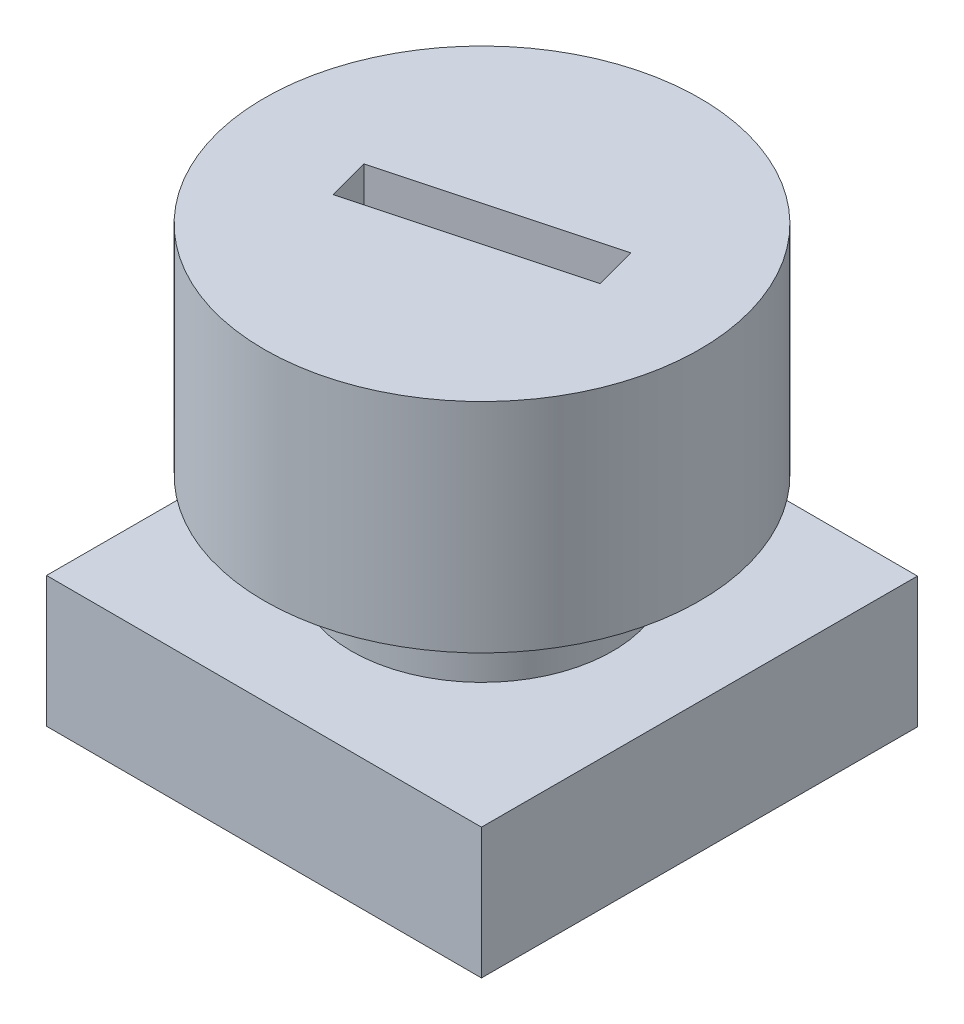
ISO-10303-21;
HEADER;
FILE_DESCRIPTION(('STEP AP214'),'2;1');
FILE_NAME('part.step','',(''),(''),'','','');
FILE_SCHEMA(('AUTOMOTIVE_DESIGN { 1 0 10303 214 1 1 1 1 }'));
ENDSEC;
DATA;
#1=APPLICATION_CONTEXT('core data for automotive mechanical design processes');
#2=APPLICATION_PROTOCOL_DEFINITION('international standard','automotive_design',2000,#1);
#3=PRODUCT_CONTEXT('',#1,'mechanical');
#4=PRODUCT('Part','Part','',(#3));
#5=PRODUCT_RELATED_PRODUCT_CATEGORY('part','',(#4));
#6=PRODUCT_DEFINITION_FORMATION('','',#4);
#7=PRODUCT_DEFINITION_CONTEXT('part definition',#1,'design');
#8=PRODUCT_DEFINITION('design','',#6,#7);
#9=PRODUCT_DEFINITION_SHAPE('','',#8);
#10=(LENGTH_UNIT() NAMED_UNIT(*) SI_UNIT(.MILLI.,.METRE.));
#11=(NAMED_UNIT(*) PLANE_ANGLE_UNIT() SI_UNIT($,.RADIAN.));
#12=(NAMED_UNIT(*) SI_UNIT($,.STERADIAN.) SOLID_ANGLE_UNIT());
#13=UNCERTAINTY_MEASURE_WITH_UNIT(LENGTH_MEASURE(1.E-05),#10,'distance_accuracy_value','');
#14=(GEOMETRIC_REPRESENTATION_CONTEXT(3) GLOBAL_UNCERTAINTY_ASSIGNED_CONTEXT((#13)) GLOBAL_UNIT_ASSIGNED_CONTEXT((#10,
#11,#12)) REPRESENTATION_CONTEXT('',''));
#15=CARTESIAN_POINT('',(0.,0.,0.));
#16=DIRECTION('',(0.,0.,1.));
#17=DIRECTION('',(1.,0.,0.));
#18=AXIS2_PLACEMENT_3D('',#15,#16,#17);
#19=CARTESIAN_POINT('',(0.,5.,0.));
#20=DIRECTION('',(0.,-1.,0.));
#21=DIRECTION('',(0.,0.,-1.));
#22=AXIS2_PLACEMENT_3D('',#19,#20,#21);
#23=CYLINDRICAL_SURFACE('',#22,5.);
#24=CARTESIAN_POINT('',(0.,5.,0.));
#25=DIRECTION('',(0.,1.,0.));
#26=DIRECTION('',(0.,0.,1.));
#27=AXIS2_PLACEMENT_3D('',#24,#25,#26);
#28=CIRCLE('',#27,5.);
#29=CARTESIAN_POINT('',(0.,5.,5.));
#30=VERTEX_POINT('',#29);
#31=EDGE_CURVE('E46',#30,#30,#28,.T.);
#32=ORIENTED_EDGE('',*,*,#31,.F.);
#33=EDGE_LOOP('',(#32));
#34=FACE_BOUND('',#33,.T.);
#35=CARTESIAN_POINT('',(0.,0.,0.));
#36=DIRECTION('',(0.,1.,0.));
#37=DIRECTION('',(0.,0.,1.));
#38=AXIS2_PLACEMENT_3D('',#35,#36,#37);
#39=CIRCLE('',#38,5.);
#40=CARTESIAN_POINT('',(0.,0.,5.));
#41=VERTEX_POINT('',#40);
#42=EDGE_CURVE('E183',#41,#41,#39,.T.);
#43=ORIENTED_EDGE('',*,*,#42,.T.);
#44=EDGE_LOOP('',(#43));
#45=FACE_BOUND('',#44,.T.);
#46=ADVANCED_FACE('F39',(#34,#45),#23,.T.);
#47=CARTESIAN_POINT('',(0.,5.,0.));
#48=DIRECTION('',(0.,1.,0.));
#49=DIRECTION('',(0.,0.,1.));
#50=AXIS2_PLACEMENT_3D('',#47,#48,#49);
#51=PLANE('',#50);
#52=DIRECTION('',(-0.258819045102243,0.,-0.965925826289143));
#53=VECTOR('',#52,1.);
#54=CARTESIAN_POINT('',(2.5442240882737,5.,-0.164084699611723));
#55=LINE('',#54,#53);
#56=CARTESIAN_POINT('',(2.5442240882737,5.,-0.164084699611723));
#57=VERTEX_POINT('',#56);
#58=CARTESIAN_POINT('',(2.28540504317146,5.,-1.13001052590085));
#59=VERTEX_POINT('',#58);
#60=EDGE_CURVE('E53',#57,#59,#55,.T.);
#61=ORIENTED_EDGE('',*,*,#60,.F.);
#62=DIRECTION('',(0.965925826289069,0.,-0.25881904510252));
#63=VECTOR('',#62,1.);
#64=CARTESIAN_POINT('',(-2.28540504317146,5.,1.13001052590083));
#65=LINE('',#64,#63);
#66=CARTESIAN_POINT('',(-2.28540504317146,5.,1.13001052590083));
#67=VERTEX_POINT('',#66);
#68=EDGE_CURVE('E133',#67,#57,#65,.T.);
#69=ORIENTED_EDGE('',*,*,#68,.F.);
#70=DIRECTION('',(0.258819045102424,0.,0.965925826289094));
#71=VECTOR('',#70,1.);
#72=CARTESIAN_POINT('',(-2.28540504317146,5.,1.13001052590083));
#73=LINE('',#72,#71);
#74=CARTESIAN_POINT('',(-2.54422408827389,5.,0.164084699611735));
#75=VERTEX_POINT('',#74);
#76=EDGE_CURVE('E136',#75,#67,#73,.T.);
#77=ORIENTED_EDGE('',*,*,#76,.F.);
#78=DIRECTION('',(-0.965925826289069,0.,0.258819045102518));
#79=VECTOR('',#78,1.);
#80=CARTESIAN_POINT('',(-2.54422408827389,5.,0.164084699611735));
#81=LINE('',#80,#79);
#82=EDGE_CURVE('E142',#59,#75,#81,.T.);
#83=ORIENTED_EDGE('',*,*,#82,.F.);
#84=EDGE_LOOP('',(#61,#69,#77,#83));
#85=FACE_BOUND('',#84,.T.);
#86=ORIENTED_EDGE('',*,*,#31,.T.);
#87=EDGE_LOOP('',(#86));
#88=FACE_BOUND('',#87,.T.);
#89=ADVANCED_FACE('F192',(#85,#88),#51,.T.);
#90=CARTESIAN_POINT('',(0.,0.,0.));
#91=DIRECTION('',(0.,1.,0.));
#92=DIRECTION('',(0.,0.,1.));
#93=AXIS2_PLACEMENT_3D('',#90,#91,#92);
#94=PLANE('',#93);
#95=CARTESIAN_POINT('',(0.,0.,0.));
#96=DIRECTION('',(0.,1.,0.));
#97=DIRECTION('',(0.,0.,1.));
#98=AXIS2_PLACEMENT_3D('',#95,#96,#97);
#99=CIRCLE('',#98,3.);
#100=CARTESIAN_POINT('',(0.,0.,3.));
#101=VERTEX_POINT('',#100);
#102=EDGE_CURVE('E11',#101,#101,#99,.F.);
#103=ORIENTED_EDGE('',*,*,#102,.F.);
#104=EDGE_LOOP('',(#103));
#105=FACE_BOUND('',#104,.T.);
#106=ORIENTED_EDGE('',*,*,#42,.F.);
#107=EDGE_LOOP('',(#106));
#108=FACE_BOUND('',#107,.T.);
#109=ADVANCED_FACE('F189',(#105,#108),#94,.F.);
#110=CARTESIAN_POINT('',(0.,-2.,0.));
#111=DIRECTION('',(0.,1.,0.));
#112=DIRECTION('',(0.,0.,1.));
#113=AXIS2_PLACEMENT_3D('',#110,#111,#112);
#114=CYLINDRICAL_SURFACE('',#113,3.);
#115=CARTESIAN_POINT('',(0.,-2.,0.));
#116=DIRECTION('',(0.,-1.,0.));
#117=DIRECTION('',(0.,0.,-1.));
#118=AXIS2_PLACEMENT_3D('',#115,#116,#117);
#119=CIRCLE('',#118,3.);
#120=CARTESIAN_POINT('',(0.,-2.,-3.));
#121=VERTEX_POINT('',#120);
#122=EDGE_CURVE('E180',#121,#121,#119,.T.);
#123=ORIENTED_EDGE('',*,*,#122,.F.);
#124=EDGE_LOOP('',(#123));
#125=FACE_BOUND('',#124,.T.);
#126=ORIENTED_EDGE('',*,*,#102,.T.);
#127=EDGE_LOOP('',(#126));
#128=FACE_BOUND('',#127,.T.);
#129=ADVANCED_FACE('F191',(#125,#128),#114,.T.);
#130=CARTESIAN_POINT('',(5.00630118971393,-5.,-4.9936908592612));
#131=DIRECTION('',(-0.999999204897513,0.,-0.00126103304527317));
#132=DIRECTION('',(-0.00126103304527317,0.,0.999999204897513));
#133=AXIS2_PLACEMENT_3D('',#130,#131,#132);
#134=PLANE('',#133);
#135=DIRECTION('',(-0.00126103304527317,0.,0.999999204897513));
#136=VECTOR('',#135,1.);
#137=CARTESIAN_POINT('',(5.00630118971393,-2.,-4.9936908592612));
#138=LINE('',#137,#136);
#139=CARTESIAN_POINT('',(5.00630118971393,-2.,-4.9936908592612));
#140=VERTEX_POINT('',#139);
#141=CARTESIAN_POINT('',(4.9936908592612,-2.,5.00630118971393));
#142=VERTEX_POINT('',#141);
#143=EDGE_CURVE('E155',#140,#142,#138,.T.);
#144=ORIENTED_EDGE('',*,*,#143,.T.);
#145=DIRECTION('',(0.,1.,0.));
#146=VECTOR('',#145,1.);
#147=CARTESIAN_POINT('',(4.9936908592612,-5.,5.00630118971393));
#148=LINE('',#147,#146);
#149=CARTESIAN_POINT('',(4.9936908592612,-5.,5.00630118971393));
#150=VERTEX_POINT('',#149);
#151=EDGE_CURVE('E178',#150,#142,#148,.T.);
#152=ORIENTED_EDGE('',*,*,#151,.F.);
#153=DIRECTION('',(-0.00126103304527317,0.,0.999999204897513));
#154=VECTOR('',#153,1.);
#155=CARTESIAN_POINT('',(5.00630118971393,-5.,-4.9936908592612));
#156=LINE('',#155,#154);
#157=CARTESIAN_POINT('',(5.00630118971393,-5.,-4.9936908592612));
#158=VERTEX_POINT('',#157);
#159=EDGE_CURVE('E158',#158,#150,#156,.T.);
#160=ORIENTED_EDGE('',*,*,#159,.F.);
#161=DIRECTION('',(0.,1.,0.));
#162=VECTOR('',#161,1.);
#163=CARTESIAN_POINT('',(5.00630118971393,-5.,-4.9936908592612));
#164=LINE('',#163,#162);
#165=EDGE_CURVE('E164',#158,#140,#164,.T.);
#166=ORIENTED_EDGE('',*,*,#165,.T.);
#167=EDGE_LOOP('',(#144,#152,#160,#166));
#168=FACE_BOUND('',#167,.T.);
#169=ADVANCED_FACE('F198',(#168),#134,.F.);
#170=CARTESIAN_POINT('',(4.9936908592612,-5.,5.00630118971393));
#171=DIRECTION('',(0.00126103304527326,0.,-0.999999204897513));
#172=DIRECTION('',(-0.999999204897513,0.,-0.00126103304527326));
#173=AXIS2_PLACEMENT_3D('',#170,#171,#172);
#174=PLANE('',#173);
#175=DIRECTION('',(-0.999999204897513,0.,-0.00126103304527326));
#176=VECTOR('',#175,1.);
#177=CARTESIAN_POINT('',(4.9936908592612,-2.,5.00630118971393));
#178=LINE('',#177,#176);
#179=CARTESIAN_POINT('',(-5.00630118971393,-2.,4.9936908592612));
#180=VERTEX_POINT('',#179);
#181=EDGE_CURVE('E167',#142,#180,#178,.T.);
#182=ORIENTED_EDGE('',*,*,#181,.T.);
#183=DIRECTION('',(0.,1.,0.));
#184=VECTOR('',#183,1.);
#185=CARTESIAN_POINT('',(-5.00630118971393,-5.,4.9936908592612));
#186=LINE('',#185,#184);
#187=CARTESIAN_POINT('',(-5.00630118971393,-5.,4.9936908592612));
#188=VERTEX_POINT('',#187);
#189=EDGE_CURVE('E175',#188,#180,#186,.T.);
#190=ORIENTED_EDGE('',*,*,#189,.F.);
#191=DIRECTION('',(-0.999999204897513,0.,-0.00126103304527326));
#192=VECTOR('',#191,1.);
#193=CARTESIAN_POINT('',(4.9936908592612,-5.,5.00630118971393));
#194=LINE('',#193,#192);
#195=EDGE_CURVE('E91',#150,#188,#194,.T.);
#196=ORIENTED_EDGE('',*,*,#195,.F.);
#197=ORIENTED_EDGE('',*,*,#151,.T.);
#198=EDGE_LOOP('',(#182,#190,#196,#197));
#199=FACE_BOUND('',#198,.T.);
#200=ADVANCED_FACE('F290',(#199),#174,.F.);
#201=CARTESIAN_POINT('',(-5.00630118971393,-5.,4.9936908592612));
#202=DIRECTION('',(0.999999204897513,0.,0.00126103304527317));
#203=DIRECTION('',(0.00126103304527317,0.,-0.999999204897513));
#204=AXIS2_PLACEMENT_3D('',#201,#202,#203);
#205=PLANE('',#204);
#206=DIRECTION('',(0.00126103304527317,0.,-0.999999204897513));
#207=VECTOR('',#206,1.);
#208=CARTESIAN_POINT('',(-5.00630118971393,-2.,4.9936908592612));
#209=LINE('',#208,#207);
#210=CARTESIAN_POINT('',(-4.9936908592612,-2.,-5.00630118971393));
#211=VERTEX_POINT('',#210);
#212=EDGE_CURVE('E169',#180,#211,#209,.T.);
#213=ORIENTED_EDGE('',*,*,#212,.T.);
#214=DIRECTION('',(0.,1.,0.));
#215=VECTOR('',#214,1.);
#216=CARTESIAN_POINT('',(-4.9936908592612,-5.,-5.00630118971393));
#217=LINE('',#216,#215);
#218=CARTESIAN_POINT('',(-4.9936908592612,-5.,-5.00630118971393));
#219=VERTEX_POINT('',#218);
#220=EDGE_CURVE('E173',#219,#211,#217,.T.);
#221=ORIENTED_EDGE('',*,*,#220,.F.);
#222=DIRECTION('',(0.00126103304527317,0.,-0.999999204897513));
#223=VECTOR('',#222,1.);
#224=CARTESIAN_POINT('',(-5.00630118971393,-5.,4.9936908592612));
#225=LINE('',#224,#223);
#226=EDGE_CURVE('E161',#188,#219,#225,.T.);
#227=ORIENTED_EDGE('',*,*,#226,.F.);
#228=ORIENTED_EDGE('',*,*,#189,.T.);
#229=EDGE_LOOP('',(#213,#221,#227,#228));
#230=FACE_BOUND('',#229,.T.);
#231=ADVANCED_FACE('F287',(#230),#205,.F.);
#232=CARTESIAN_POINT('',(-4.9936908592612,-5.,-5.00630118971393));
#233=DIRECTION('',(-0.00126103304527326,0.,0.999999204897513));
#234=DIRECTION('',(0.999999204897513,0.,0.00126103304527326));
#235=AXIS2_PLACEMENT_3D('',#232,#233,#234);
#236=PLANE('',#235);
#237=DIRECTION('',(0.999999204897513,0.,0.00126103304527326));
#238=VECTOR('',#237,1.);
#239=CARTESIAN_POINT('',(-4.9936908592612,-2.,-5.00630118971393));
#240=LINE('',#239,#238);
#241=EDGE_CURVE('E83',#211,#140,#240,.T.);
#242=ORIENTED_EDGE('',*,*,#241,.T.);
#243=ORIENTED_EDGE('',*,*,#165,.F.);
#244=DIRECTION('',(0.999999204897513,0.,0.00126103304527326));
#245=VECTOR('',#244,1.);
#246=CARTESIAN_POINT('',(-4.9936908592612,-5.,-5.00630118971393));
#247=LINE('',#246,#245);
#248=EDGE_CURVE('E62',#219,#158,#247,.T.);
#249=ORIENTED_EDGE('',*,*,#248,.F.);
#250=ORIENTED_EDGE('',*,*,#220,.T.);
#251=EDGE_LOOP('',(#242,#243,#249,#250));
#252=FACE_BOUND('',#251,.T.);
#253=ADVANCED_FACE('F280',(#252),#236,.F.);
#254=CARTESIAN_POINT('',(0.,-5.,0.));
#255=DIRECTION('',(0.,-1.,0.));
#256=DIRECTION('',(0.,0.,-1.));
#257=AXIS2_PLACEMENT_3D('',#254,#255,#256);
#258=PLANE('',#257);
#259=CARTESIAN_POINT('',(0.,-5.,0.));
#260=DIRECTION('',(0.,-1.,0.));
#261=DIRECTION('',(0.,0.,-1.));
#262=AXIS2_PLACEMENT_3D('',#259,#260,#261);
#263=CIRCLE('',#262,2.5);
#264=CARTESIAN_POINT('',(0.,-5.,-2.5));
#265=VERTEX_POINT('',#264);
#266=EDGE_CURVE('E148',#265,#265,#263,.T.);
#267=ORIENTED_EDGE('',*,*,#266,.F.);
#268=EDGE_LOOP('',(#267));
#269=FACE_BOUND('',#268,.T.);
#270=ORIENTED_EDGE('',*,*,#159,.T.);
#271=ORIENTED_EDGE('',*,*,#195,.T.);
#272=ORIENTED_EDGE('',*,*,#226,.T.);
#273=ORIENTED_EDGE('',*,*,#248,.T.);
#274=EDGE_LOOP('',(#270,#271,#272,#273));
#275=FACE_BOUND('',#274,.T.);
#276=ADVANCED_FACE('F277',(#269,#275),#258,.T.);
#277=CARTESIAN_POINT('',(0.,-2.,0.));
#278=DIRECTION('',(0.,-1.,0.));
#279=DIRECTION('',(0.,0.,-1.));
#280=AXIS2_PLACEMENT_3D('',#277,#278,#279);
#281=PLANE('',#280);
#282=ORIENTED_EDGE('',*,*,#122,.T.);
#283=EDGE_LOOP('',(#282));
#284=FACE_BOUND('',#283,.T.);
#285=ORIENTED_EDGE('',*,*,#143,.F.);
#286=ORIENTED_EDGE('',*,*,#241,.F.);
#287=ORIENTED_EDGE('',*,*,#212,.F.);
#288=ORIENTED_EDGE('',*,*,#181,.F.);
#289=EDGE_LOOP('',(#285,#286,#287,#288));
#290=FACE_BOUND('',#289,.T.);
#291=ADVANCED_FACE('F275',(#284,#290),#281,.F.);
#292=CARTESIAN_POINT('',(0.,1.,0.));
#293=DIRECTION('',(0.,-1.,0.));
#294=DIRECTION('',(0.,0.,-1.));
#295=AXIS2_PLACEMENT_3D('',#292,#293,#294);
#296=CYLINDRICAL_SURFACE('',#295,2.5);
#297=CARTESIAN_POINT('',(0.,1.,0.));
#298=DIRECTION('',(0.,-1.,0.));
#299=DIRECTION('',(0.,0.,-1.));
#300=AXIS2_PLACEMENT_3D('',#297,#298,#299);
#301=CIRCLE('',#300,2.5);
#302=CARTESIAN_POINT('',(0.,1.,-2.5));
#303=VERTEX_POINT('',#302);
#304=EDGE_CURVE('E152',#303,#303,#301,.T.);
#305=ORIENTED_EDGE('',*,*,#304,.F.);
#306=EDGE_LOOP('',(#305));
#307=FACE_BOUND('',#306,.T.);
#308=ORIENTED_EDGE('',*,*,#266,.T.);
#309=EDGE_LOOP('',(#308));
#310=FACE_BOUND('',#309,.T.);
#311=ADVANCED_FACE('F271',(#307,#310),#296,.F.);
#312=CARTESIAN_POINT('',(0.,1.,0.));
#313=DIRECTION('',(0.,-1.,0.));
#314=DIRECTION('',(0.,0.,-1.));
#315=AXIS2_PLACEMENT_3D('',#312,#313,#314);
#316=PLANE('',#315);
#317=ORIENTED_EDGE('',*,*,#304,.T.);
#318=EDGE_LOOP('',(#317));
#319=FACE_BOUND('',#318,.T.);
#320=ADVANCED_FACE('F221',(#319),#316,.T.);
#321=CARTESIAN_POINT('',(2.5442240882737,2.,-0.164084699611723));
#322=DIRECTION('',(0.965925826289143,0.,-0.258819045102243));
#323=DIRECTION('',(-0.258819045102243,0.,-0.965925826289143));
#324=AXIS2_PLACEMENT_3D('',#321,#322,#323);
#325=PLANE('',#324);
#326=ORIENTED_EDGE('',*,*,#60,.T.);
#327=DIRECTION('',(0.,1.,0.));
#328=VECTOR('',#327,1.);
#329=CARTESIAN_POINT('',(2.28540504317146,2.,-1.13001052590085));
#330=LINE('',#329,#328);
#331=CARTESIAN_POINT('',(2.28540504317146,2.,-1.13001052590085));
#332=VERTEX_POINT('',#331);
#333=EDGE_CURVE('E111',#332,#59,#330,.T.);
#334=ORIENTED_EDGE('',*,*,#333,.F.);
#335=DIRECTION('',(-0.258819045102243,0.,-0.965925826289143));
#336=VECTOR('',#335,1.);
#337=CARTESIAN_POINT('',(2.5442240882737,2.,-0.164084699611723));
#338=LINE('',#337,#336);
#339=CARTESIAN_POINT('',(2.5442240882737,2.,-0.164084699611723));
#340=VERTEX_POINT('',#339);
#341=EDGE_CURVE('E115',#340,#332,#338,.T.);
#342=ORIENTED_EDGE('',*,*,#341,.F.);
#343=DIRECTION('',(0.,1.,0.));
#344=VECTOR('',#343,1.);
#345=CARTESIAN_POINT('',(2.5442240882737,2.,-0.164084699611723));
#346=LINE('',#345,#344);
#347=EDGE_CURVE('E146',#340,#57,#346,.T.);
#348=ORIENTED_EDGE('',*,*,#347,.T.);
#349=EDGE_LOOP('',(#326,#334,#342,#348));
#350=FACE_BOUND('',#349,.T.);
#351=ADVANCED_FACE('F113',(#350),#325,.F.);
#352=CARTESIAN_POINT('',(-2.28540504317146,2.,1.13001052590083));
#353=DIRECTION('',(0.25881904510252,0.,0.965925826289069));
#354=DIRECTION('',(0.965925826289069,0.,-0.25881904510252));
#355=AXIS2_PLACEMENT_3D('',#352,#353,#354);
#356=PLANE('',#355);
#357=ORIENTED_EDGE('',*,*,#68,.T.);
#358=ORIENTED_EDGE('',*,*,#347,.F.);
#359=DIRECTION('',(0.965925826289069,0.,-0.25881904510252));
#360=VECTOR('',#359,1.);
#361=CARTESIAN_POINT('',(-2.28540504317146,2.,1.13001052590083));
#362=LINE('',#361,#360);
#363=CARTESIAN_POINT('',(-2.28540504317146,2.,1.13001052590083));
#364=VERTEX_POINT('',#363);
#365=EDGE_CURVE('E121',#364,#340,#362,.T.);
#366=ORIENTED_EDGE('',*,*,#365,.F.);
#367=DIRECTION('',(0.,1.,0.));
#368=VECTOR('',#367,1.);
#369=CARTESIAN_POINT('',(-2.28540504317146,2.,1.13001052590083));
#370=LINE('',#369,#368);
#371=EDGE_CURVE('E149',#364,#67,#370,.T.);
#372=ORIENTED_EDGE('',*,*,#371,.T.);
#373=EDGE_LOOP('',(#357,#358,#366,#372));
#374=FACE_BOUND('',#373,.T.);
#375=ADVANCED_FACE('F230',(#374),#356,.F.);
#376=CARTESIAN_POINT('',(-2.28540504317146,2.,1.13001052590083));
#377=DIRECTION('',(-0.965925826289094,0.,0.258819045102424));
#378=DIRECTION('',(0.258819045102424,0.,0.965925826289094));
#379=AXIS2_PLACEMENT_3D('',#376,#377,#378);
#380=PLANE('',#379);
#381=ORIENTED_EDGE('',*,*,#76,.T.);
#382=ORIENTED_EDGE('',*,*,#371,.F.);
#383=DIRECTION('',(0.258819045102424,0.,0.965925826289094));
#384=VECTOR('',#383,1.);
#385=CARTESIAN_POINT('',(-2.28540504317146,2.,1.13001052590083));
#386=LINE('',#385,#384);
#387=CARTESIAN_POINT('',(-2.54422408827389,2.,0.164084699611735));
#388=VERTEX_POINT('',#387);
#389=EDGE_CURVE('E129',#388,#364,#386,.T.);
#390=ORIENTED_EDGE('',*,*,#389,.F.);
#391=DIRECTION('',(0.,1.,0.));
#392=VECTOR('',#391,1.);
#393=CARTESIAN_POINT('',(-2.54422408827389,2.,0.164084699611735));
#394=LINE('',#393,#392);
#395=EDGE_CURVE('E120',#388,#75,#394,.T.);
#396=ORIENTED_EDGE('',*,*,#395,.T.);
#397=EDGE_LOOP('',(#381,#382,#390,#396));
#398=FACE_BOUND('',#397,.T.);
#399=ADVANCED_FACE('F239',(#398),#380,.F.);
#400=CARTESIAN_POINT('',(-2.54422408827389,2.,0.164084699611735));
#401=DIRECTION('',(-0.258819045102518,0.,-0.965925826289069));
#402=DIRECTION('',(-0.965925826289069,0.,0.258819045102518));
#403=AXIS2_PLACEMENT_3D('',#400,#401,#402);
#404=PLANE('',#403);
#405=ORIENTED_EDGE('',*,*,#82,.T.);
#406=ORIENTED_EDGE('',*,*,#395,.F.);
#407=DIRECTION('',(-0.965925826289069,0.,0.258819045102518));
#408=VECTOR('',#407,1.);
#409=CARTESIAN_POINT('',(-2.54422408827389,2.,0.164084699611735));
#410=LINE('',#409,#408);
#411=EDGE_CURVE('E124',#332,#388,#410,.T.);
#412=ORIENTED_EDGE('',*,*,#411,.F.);
#413=ORIENTED_EDGE('',*,*,#333,.T.);
#414=EDGE_LOOP('',(#405,#406,#412,#413));
#415=FACE_BOUND('',#414,.T.);
#416=ADVANCED_FACE('F125',(#415),#404,.F.);
#417=CARTESIAN_POINT('',(0.,2.,0.));
#418=DIRECTION('',(0.,-1.,0.));
#419=DIRECTION('',(0.,0.,-1.));
#420=AXIS2_PLACEMENT_3D('',#417,#418,#419);
#421=PLANE('',#420);
#422=ORIENTED_EDGE('',*,*,#341,.T.);
#423=ORIENTED_EDGE('',*,*,#411,.T.);
#424=ORIENTED_EDGE('',*,*,#389,.T.);
#425=ORIENTED_EDGE('',*,*,#365,.T.);
#426=EDGE_LOOP('',(#422,#423,#424,#425));
#427=FACE_BOUND('',#426,.T.);
#428=ADVANCED_FACE('F131',(#427),#421,.F.);
#429=CLOSED_SHELL('',(#46,#89,#109,#129,#169,#200,#231,#253,#276,#291,#311,#320,#351,#375,#399,
#416,#428));
#430=MANIFOLD_SOLID_BREP('B2',#429);
#431=ADVANCED_BREP_SHAPE_REPRESENTATION('',(#18,#430),#14);
#432=SHAPE_DEFINITION_REPRESENTATION(#9,#431);
ENDSEC;
END-ISO-10303-21;
